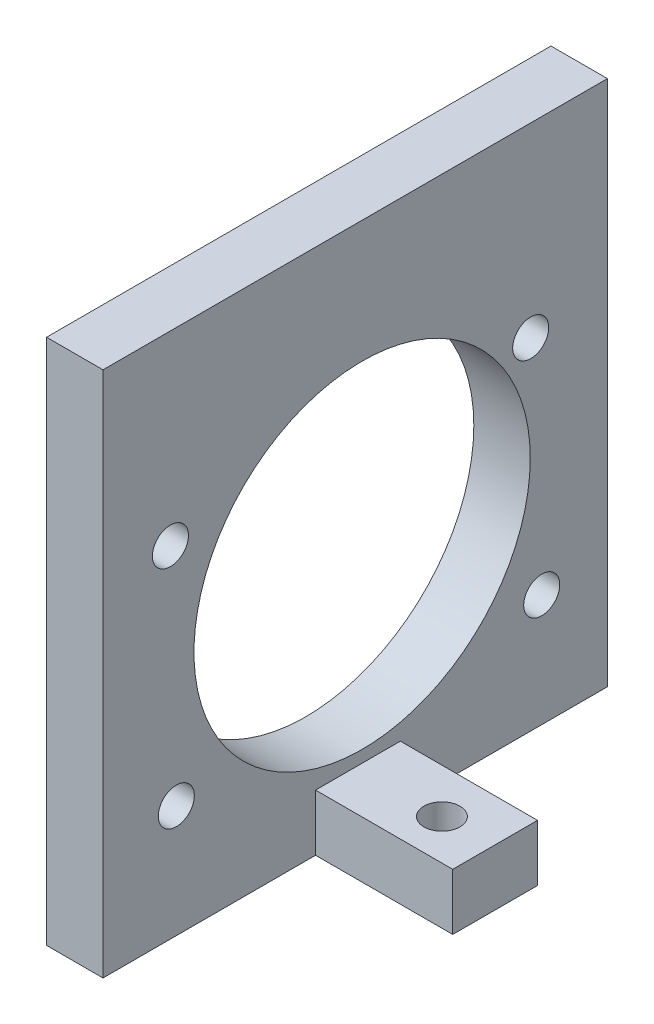
ISO-10303-21;
HEADER;
FILE_DESCRIPTION(('STEP AP214'),'2;1');
FILE_NAME('part.step','',(''),(''),'','','');
FILE_SCHEMA(('AUTOMOTIVE_DESIGN { 1 0 10303 214 1 1 1 1 }'));
ENDSEC;
DATA;
#1=APPLICATION_CONTEXT('core data for automotive mechanical design processes');
#2=APPLICATION_PROTOCOL_DEFINITION('international standard','automotive_design',2000,#1);
#3=PRODUCT_CONTEXT('',#1,'mechanical');
#4=PRODUCT('Part','Part','',(#3));
#5=PRODUCT_RELATED_PRODUCT_CATEGORY('part','',(#4));
#6=PRODUCT_DEFINITION_FORMATION('','',#4);
#7=PRODUCT_DEFINITION_CONTEXT('part definition',#1,'design');
#8=PRODUCT_DEFINITION('design','',#6,#7);
#9=PRODUCT_DEFINITION_SHAPE('','',#8);
#10=(LENGTH_UNIT() NAMED_UNIT(*) SI_UNIT(.MILLI.,.METRE.));
#11=(NAMED_UNIT(*) PLANE_ANGLE_UNIT() SI_UNIT($,.RADIAN.));
#12=(NAMED_UNIT(*) SI_UNIT($,.STERADIAN.) SOLID_ANGLE_UNIT());
#13=UNCERTAINTY_MEASURE_WITH_UNIT(LENGTH_MEASURE(1.E-05),#10,'distance_accuracy_value','');
#14=(GEOMETRIC_REPRESENTATION_CONTEXT(3) GLOBAL_UNCERTAINTY_ASSIGNED_CONTEXT((#13)) GLOBAL_UNIT_ASSIGNED_CONTEXT((#10,
#11,#12)) REPRESENTATION_CONTEXT('',''));
#15=CARTESIAN_POINT('',(0.,0.,0.));
#16=DIRECTION('',(0.,0.,1.));
#17=DIRECTION('',(1.,0.,0.));
#18=AXIS2_PLACEMENT_3D('',#15,#16,#17);
#19=CARTESIAN_POINT('',(0.,-4.7,-42.));
#20=DIRECTION('',(0.,-1.,0.));
#21=DIRECTION('',(0.,0.,-1.));
#22=AXIS2_PLACEMENT_3D('',#19,#20,#21);
#23=PLANE('',#22);
#24=DIRECTION('',(0.,0.,1.));
#25=VECTOR('',#24,1.);
#26=CARTESIAN_POINT('',(11.4209266178207,-4.7,-24.7581515831649));
#27=LINE('',#26,#25);
#28=CARTESIAN_POINT('',(11.4209266178207,-4.7,-24.7581515831649));
#29=VERTEX_POINT('',#28);
#30=CARTESIAN_POINT('',(11.4209266178207,-4.7,-17.6984171354406));
#31=VERTEX_POINT('',#30);
#32=EDGE_CURVE('E62',#29,#31,#27,.T.);
#33=ORIENTED_EDGE('',*,*,#32,.T.);
#34=DIRECTION('',(-1.,0.,0.));
#35=VECTOR('',#34,1.);
#36=CARTESIAN_POINT('',(0.,-4.7,-17.6984171354406));
#37=LINE('',#36,#35);
#38=CARTESIAN_POINT('',(0.,-4.7,-17.6984171354406));
#39=VERTEX_POINT('',#38);
#40=EDGE_CURVE('E124',#31,#39,#37,.T.);
#41=ORIENTED_EDGE('',*,*,#40,.T.);
#42=DIRECTION('',(0.,0.,1.));
#43=VECTOR('',#42,1.);
#44=CARTESIAN_POINT('',(0.,-4.7,-17.6984171354406));
#45=LINE('',#44,#43);
#46=CARTESIAN_POINT('',(0.,-4.7,0.));
#47=VERTEX_POINT('',#46);
#48=EDGE_CURVE('E136',#39,#47,#45,.T.);
#49=ORIENTED_EDGE('',*,*,#48,.T.);
#50=DIRECTION('',(1.,0.,0.));
#51=VECTOR('',#50,1.);
#52=CARTESIAN_POINT('',(0.,-4.7,0.));
#53=LINE('',#52,#51);
#54=CARTESIAN_POINT('',(-4.7,-4.7,0.));
#55=VERTEX_POINT('',#54);
#56=EDGE_CURVE('E203',#55,#47,#53,.T.);
#57=ORIENTED_EDGE('',*,*,#56,.F.);
#58=DIRECTION('',(0.,0.,1.));
#59=VECTOR('',#58,1.);
#60=CARTESIAN_POINT('',(-4.7,-4.7,-42.));
#61=LINE('',#60,#59);
#62=CARTESIAN_POINT('',(-4.7,-4.7,-42.));
#63=VERTEX_POINT('',#62);
#64=EDGE_CURVE('E11',#63,#55,#61,.T.);
#65=ORIENTED_EDGE('',*,*,#64,.F.);
#66=DIRECTION('',(1.,0.,0.));
#67=VECTOR('',#66,1.);
#68=CARTESIAN_POINT('',(0.,-4.7,-42.));
#69=LINE('',#68,#67);
#70=CARTESIAN_POINT('',(0.,-4.7,-42.));
#71=VERTEX_POINT('',#70);
#72=EDGE_CURVE('E207',#63,#71,#69,.T.);
#73=ORIENTED_EDGE('',*,*,#72,.T.);
#74=DIRECTION('',(0.,0.,1.));
#75=VECTOR('',#74,1.);
#76=CARTESIAN_POINT('',(0.,-4.7,-42.));
#77=LINE('',#76,#75);
#78=CARTESIAN_POINT('',(0.,-4.7,-24.7581515831649));
#79=VERTEX_POINT('',#78);
#80=EDGE_CURVE('E154',#71,#79,#77,.T.);
#81=ORIENTED_EDGE('',*,*,#80,.T.);
#82=DIRECTION('',(1.,0.,0.));
#83=VECTOR('',#82,1.);
#84=CARTESIAN_POINT('',(0.,-4.7,-24.7581515831649));
#85=LINE('',#84,#83);
#86=EDGE_CURVE('E128',#79,#29,#85,.T.);
#87=ORIENTED_EDGE('',*,*,#86,.T.);
#88=EDGE_LOOP('',(#33,#41,#49,#57,#65,#73,#81,#87));
#89=FACE_BOUND('',#88,.T.);
#90=CARTESIAN_POINT('',(7.16622607131473,-4.7,-21.0521348067814));
#91=DIRECTION('',(0.,1.,0.));
#92=DIRECTION('',(0.,0.,1.));
#93=AXIS2_PLACEMENT_3D('',#90,#91,#92);
#94=CIRCLE('',#93,1.5);
#95=CARTESIAN_POINT('',(7.16622607131473,-4.7,-19.5521348067814));
#96=VERTEX_POINT('',#95);
#97=EDGE_CURVE('E199',#96,#96,#94,.T.);
#98=ORIENTED_EDGE('',*,*,#97,.T.);
#99=EDGE_LOOP('',(#98));
#100=FACE_BOUND('',#99,.T.);
#101=ADVANCED_FACE('F45',(#89,#100),#23,.T.);
#102=CARTESIAN_POINT('',(-4.7,0.,-42.));
#103=DIRECTION('',(-1.,0.,0.));
#104=DIRECTION('',(0.,0.,1.));
#105=AXIS2_PLACEMENT_3D('',#102,#103,#104);
#106=PLANE('',#105);
#107=CARTESIAN_POINT('',(-4.7,4.65966855667947,-6.10133774647746));
#108=DIRECTION('',(1.,0.,0.));
#109=DIRECTION('',(0.,0.,-1.));
#110=AXIS2_PLACEMENT_3D('',#107,#108,#109);
#111=CIRCLE('',#110,1.5);
#112=CARTESIAN_POINT('',(-4.7,4.65966855667947,-7.60133774647746));
#113=VERTEX_POINT('',#112);
#114=EDGE_CURVE('E172',#113,#113,#111,.T.);
#115=ORIENTED_EDGE('',*,*,#114,.T.);
#116=EDGE_LOOP('',(#115));
#117=FACE_BOUND('',#116,.T.);
#118=CARTESIAN_POINT('',(-4.7,23.6596685566795,-35.612051992341));
#119=DIRECTION('',(1.,0.,0.));
#120=DIRECTION('',(0.,0.,-1.));
#121=AXIS2_PLACEMENT_3D('',#118,#119,#120);
#122=CIRCLE('',#121,1.5);
#123=CARTESIAN_POINT('',(-4.7,23.6596685566795,-37.112051992341));
#124=VERTEX_POINT('',#123);
#125=EDGE_CURVE('E163',#124,#124,#122,.T.);
#126=ORIENTED_EDGE('',*,*,#125,.T.);
#127=EDGE_LOOP('',(#126));
#128=FACE_BOUND('',#127,.T.);
#129=CARTESIAN_POINT('',(-4.7,4.65966855667947,-36.5294627813469));
#130=DIRECTION('',(1.,0.,0.));
#131=DIRECTION('',(0.,0.,-1.));
#132=AXIS2_PLACEMENT_3D('',#129,#130,#131);
#133=CIRCLE('',#132,1.5);
#134=CARTESIAN_POINT('',(-4.7,4.65966855667947,-38.0294627813469));
#135=VERTEX_POINT('',#134);
#136=EDGE_CURVE('E140',#135,#135,#133,.T.);
#137=ORIENTED_EDGE('',*,*,#136,.T.);
#138=EDGE_LOOP('',(#137));
#139=FACE_BOUND('',#138,.T.);
#140=CARTESIAN_POINT('',(-4.7,23.6596685566795,-5.61205199234096));
#141=DIRECTION('',(1.,0.,0.));
#142=DIRECTION('',(0.,0.,-1.));
#143=AXIS2_PLACEMENT_3D('',#140,#141,#142);
#144=CIRCLE('',#143,1.5);
#145=CARTESIAN_POINT('',(-4.7,23.6596685566795,-7.11205199234096));
#146=VERTEX_POINT('',#145);
#147=EDGE_CURVE('E183',#146,#146,#144,.T.);
#148=ORIENTED_EDGE('',*,*,#147,.T.);
#149=EDGE_LOOP('',(#148));
#150=FACE_BOUND('',#149,.T.);
#151=CARTESIAN_POINT('',(-4.7,14.9958301128132,-21.5749997210445));
#152=DIRECTION('',(1.,0.,0.));
#153=DIRECTION('',(0.,0.,-1.));
#154=AXIS2_PLACEMENT_3D('',#151,#152,#153);
#155=CIRCLE('',#154,14.);
#156=CARTESIAN_POINT('',(-4.7,14.9958301128132,-35.5749997210445));
#157=VERTEX_POINT('',#156);
#158=EDGE_CURVE('E191',#157,#157,#155,.T.);
#159=ORIENTED_EDGE('',*,*,#158,.T.);
#160=EDGE_LOOP('',(#159));
#161=FACE_BOUND('',#160,.T.);
#162=DIRECTION('',(0.,1.,0.));
#163=VECTOR('',#162,1.);
#164=CARTESIAN_POINT('',(-4.7,0.,0.));
#165=LINE('',#164,#163);
#166=CARTESIAN_POINT('',(-4.7,39.156392732122,0.));
#167=VERTEX_POINT('',#166);
#168=EDGE_CURVE('E211',#167,#55,#165,.F.);
#169=ORIENTED_EDGE('',*,*,#168,.F.);
#170=DIRECTION('',(0.,0.,1.));
#171=VECTOR('',#170,1.);
#172=CARTESIAN_POINT('',(-4.7,39.156392732122,-42.));
#173=LINE('',#172,#171);
#174=CARTESIAN_POINT('',(-4.7,39.156392732122,-42.));
#175=VERTEX_POINT('',#174);
#176=EDGE_CURVE('E54',#175,#167,#173,.T.);
#177=ORIENTED_EDGE('',*,*,#176,.F.);
#178=DIRECTION('',(0.,1.,0.));
#179=VECTOR('',#178,1.);
#180=CARTESIAN_POINT('',(-4.7,0.,-42.));
#181=LINE('',#180,#179);
#182=EDGE_CURVE('E217',#175,#63,#181,.F.);
#183=ORIENTED_EDGE('',*,*,#182,.T.);
#184=ORIENTED_EDGE('',*,*,#64,.T.);
#185=EDGE_LOOP('',(#169,#177,#183,#184));
#186=FACE_BOUND('',#185,.T.);
#187=ADVANCED_FACE('F253',(#117,#128,#139,#150,#161,#186),#106,.T.);
#188=CARTESIAN_POINT('',(-4.7,39.156392732122,-42.));
#189=DIRECTION('',(0.,-1.,0.));
#190=DIRECTION('',(0.,0.,-1.));
#191=AXIS2_PLACEMENT_3D('',#188,#189,#190);
#192=PLANE('',#191);
#193=DIRECTION('',(1.,0.,0.));
#194=VECTOR('',#193,1.);
#195=CARTESIAN_POINT('',(-4.7,39.156392732122,0.));
#196=LINE('',#195,#194);
#197=CARTESIAN_POINT('',(0.,39.156392732122,0.));
#198=VERTEX_POINT('',#197);
#199=EDGE_CURVE('E227',#167,#198,#196,.T.);
#200=ORIENTED_EDGE('',*,*,#199,.T.);
#201=DIRECTION('',(0.,0.,1.));
#202=VECTOR('',#201,1.);
#203=CARTESIAN_POINT('',(0.,39.156392732122,-42.));
#204=LINE('',#203,#202);
#205=CARTESIAN_POINT('',(0.,39.156392732122,-42.));
#206=VERTEX_POINT('',#205);
#207=EDGE_CURVE('E234',#206,#198,#204,.T.);
#208=ORIENTED_EDGE('',*,*,#207,.F.);
#209=DIRECTION('',(1.,0.,0.));
#210=VECTOR('',#209,1.);
#211=CARTESIAN_POINT('',(-4.7,39.156392732122,-42.));
#212=LINE('',#211,#210);
#213=EDGE_CURVE('E214',#175,#206,#212,.T.);
#214=ORIENTED_EDGE('',*,*,#213,.F.);
#215=ORIENTED_EDGE('',*,*,#176,.T.);
#216=EDGE_LOOP('',(#200,#208,#214,#215));
#217=FACE_BOUND('',#216,.T.);
#218=ADVANCED_FACE('F258',(#217),#192,.F.);
#219=CARTESIAN_POINT('',(0.,0.,-42.));
#220=DIRECTION('',(-1.,0.,0.));
#221=DIRECTION('',(0.,0.,1.));
#222=AXIS2_PLACEMENT_3D('',#219,#220,#221);
#223=PLANE('',#222);
#224=CARTESIAN_POINT('',(0.,4.65966855667947,-6.10133774647746));
#225=DIRECTION('',(1.,0.,0.));
#226=DIRECTION('',(0.,0.,-1.));
#227=AXIS2_PLACEMENT_3D('',#224,#225,#226);
#228=CIRCLE('',#227,1.5);
#229=CARTESIAN_POINT('',(0.,4.65966855667947,-7.60133774647746));
#230=VERTEX_POINT('',#229);
#231=EDGE_CURVE('E167',#230,#230,#228,.T.);
#232=ORIENTED_EDGE('',*,*,#231,.F.);
#233=EDGE_LOOP('',(#232));
#234=FACE_BOUND('',#233,.T.);
#235=CARTESIAN_POINT('',(0.,23.6596685566795,-35.612051992341));
#236=DIRECTION('',(1.,0.,0.));
#237=DIRECTION('',(0.,0.,-1.));
#238=AXIS2_PLACEMENT_3D('',#235,#236,#237);
#239=CIRCLE('',#238,1.5);
#240=CARTESIAN_POINT('',(0.,23.6596685566795,-37.112051992341));
#241=VERTEX_POINT('',#240);
#242=EDGE_CURVE('E176',#241,#241,#239,.T.);
#243=ORIENTED_EDGE('',*,*,#242,.F.);
#244=EDGE_LOOP('',(#243));
#245=FACE_BOUND('',#244,.T.);
#246=CARTESIAN_POINT('',(0.,4.65966855667947,-36.5294627813469));
#247=DIRECTION('',(1.,0.,0.));
#248=DIRECTION('',(0.,0.,-1.));
#249=AXIS2_PLACEMENT_3D('',#246,#247,#248);
#250=CIRCLE('',#249,1.5);
#251=CARTESIAN_POINT('',(0.,4.65966855667947,-38.0294627813469));
#252=VERTEX_POINT('',#251);
#253=EDGE_CURVE('E159',#252,#252,#250,.T.);
#254=ORIENTED_EDGE('',*,*,#253,.F.);
#255=EDGE_LOOP('',(#254));
#256=FACE_BOUND('',#255,.T.);
#257=CARTESIAN_POINT('',(0.,23.6596685566795,-5.61205199234096));
#258=DIRECTION('',(1.,0.,0.));
#259=DIRECTION('',(0.,0.,-1.));
#260=AXIS2_PLACEMENT_3D('',#257,#258,#259);
#261=CIRCLE('',#260,1.5);
#262=CARTESIAN_POINT('',(0.,23.6596685566795,-7.11205199234096));
#263=VERTEX_POINT('',#262);
#264=EDGE_CURVE('E171',#263,#263,#261,.T.);
#265=ORIENTED_EDGE('',*,*,#264,.F.);
#266=EDGE_LOOP('',(#265));
#267=FACE_BOUND('',#266,.T.);
#268=CARTESIAN_POINT('',(0.,14.9958301128132,-21.5749997210445));
#269=DIRECTION('',(1.,0.,0.));
#270=DIRECTION('',(0.,0.,-1.));
#271=AXIS2_PLACEMENT_3D('',#268,#269,#270);
#272=CIRCLE('',#271,14.);
#273=CARTESIAN_POINT('',(0.,14.9958301128132,-35.5749997210445));
#274=VERTEX_POINT('',#273);
#275=EDGE_CURVE('E187',#274,#274,#272,.T.);
#276=ORIENTED_EDGE('',*,*,#275,.F.);
#277=EDGE_LOOP('',(#276));
#278=FACE_BOUND('',#277,.T.);
#279=DIRECTION('',(0.,-1.,0.));
#280=VECTOR('',#279,1.);
#281=CARTESIAN_POINT('',(0.,0.,0.));
#282=LINE('',#281,#280);
#283=EDGE_CURVE('E224',#198,#47,#282,.T.);
#284=ORIENTED_EDGE('',*,*,#283,.T.);
#285=ORIENTED_EDGE('',*,*,#48,.F.);
#286=DIRECTION('',(0.,1.,0.));
#287=VECTOR('',#286,1.);
#288=CARTESIAN_POINT('',(0.,-4.7,-17.6984171354406));
#289=LINE('',#288,#287);
#290=CARTESIAN_POINT('',(0.,0.,-17.6984171354406));
#291=VERTEX_POINT('',#290);
#292=EDGE_CURVE('E133',#39,#291,#289,.T.);
#293=ORIENTED_EDGE('',*,*,#292,.T.);
#294=DIRECTION('',(0.,0.,1.));
#295=VECTOR('',#294,1.);
#296=CARTESIAN_POINT('',(0.,0.,-42.));
#297=LINE('',#296,#295);
#298=CARTESIAN_POINT('',(0.,0.,-24.7581515831649));
#299=VERTEX_POINT('',#298);
#300=EDGE_CURVE('E48',#299,#291,#297,.T.);
#301=ORIENTED_EDGE('',*,*,#300,.F.);
#302=DIRECTION('',(0.,1.,0.));
#303=VECTOR('',#302,1.);
#304=CARTESIAN_POINT('',(0.,-4.7,-24.7581515831649));
#305=LINE('',#304,#303);
#306=EDGE_CURVE('E148',#79,#299,#305,.T.);
#307=ORIENTED_EDGE('',*,*,#306,.F.);
#308=ORIENTED_EDGE('',*,*,#80,.F.);
#309=DIRECTION('',(0.,-1.,0.));
#310=VECTOR('',#309,1.);
#311=CARTESIAN_POINT('',(0.,0.,-42.));
#312=LINE('',#311,#310);
#313=EDGE_CURVE('E70',#206,#71,#312,.T.);
#314=ORIENTED_EDGE('',*,*,#313,.F.);
#315=ORIENTED_EDGE('',*,*,#207,.T.);
#316=EDGE_LOOP('',(#284,#285,#293,#301,#307,#308,#314,#315));
#317=FACE_BOUND('',#316,.T.);
#318=ADVANCED_FACE('F246',(#234,#245,#256,#267,#278,#317),#223,.F.);
#319=CARTESIAN_POINT('',(0.,0.,-42.));
#320=DIRECTION('',(0.,-1.,0.));
#321=DIRECTION('',(0.,0.,-1.));
#322=AXIS2_PLACEMENT_3D('',#319,#320,#321);
#323=PLANE('',#322);
#324=CARTESIAN_POINT('',(7.16622607131473,0.,-21.0521348067814));
#325=DIRECTION('',(0.,1.,0.));
#326=DIRECTION('',(0.,0.,1.));
#327=AXIS2_PLACEMENT_3D('',#324,#325,#326);
#328=CIRCLE('',#327,1.5);
#329=CARTESIAN_POINT('',(7.16622607131473,0.,-19.5521348067814));
#330=VERTEX_POINT('',#329);
#331=EDGE_CURVE('E195',#330,#330,#328,.T.);
#332=ORIENTED_EDGE('',*,*,#331,.F.);
#333=EDGE_LOOP('',(#332));
#334=FACE_BOUND('',#333,.T.);
#335=DIRECTION('',(-1.,0.,0.));
#336=VECTOR('',#335,1.);
#337=CARTESIAN_POINT('',(0.,0.,-17.6984171354406));
#338=LINE('',#337,#336);
#339=CARTESIAN_POINT('',(11.4209266178207,0.,-17.6984171354406));
#340=VERTEX_POINT('',#339);
#341=EDGE_CURVE('E142',#340,#291,#338,.T.);
#342=ORIENTED_EDGE('',*,*,#341,.F.);
#343=DIRECTION('',(0.,0.,1.));
#344=VECTOR('',#343,1.);
#345=CARTESIAN_POINT('',(11.4209266178207,0.,-24.7581515831649));
#346=LINE('',#345,#344);
#347=CARTESIAN_POINT('',(11.4209266178207,0.,-24.7581515831649));
#348=VERTEX_POINT('',#347);
#349=EDGE_CURVE('E113',#348,#340,#346,.T.);
#350=ORIENTED_EDGE('',*,*,#349,.F.);
#351=DIRECTION('',(1.,0.,0.));
#352=VECTOR('',#351,1.);
#353=CARTESIAN_POINT('',(0.,0.,-24.7581515831649));
#354=LINE('',#353,#352);
#355=EDGE_CURVE('E146',#299,#348,#354,.T.);
#356=ORIENTED_EDGE('',*,*,#355,.F.);
#357=ORIENTED_EDGE('',*,*,#300,.T.);
#358=EDGE_LOOP('',(#342,#350,#356,#357));
#359=FACE_BOUND('',#358,.T.);
#360=ADVANCED_FACE('F245',(#334,#359),#323,.F.);
#361=CARTESIAN_POINT('',(0.,0.,-42.));
#362=DIRECTION('',(0.,0.,-1.));
#363=DIRECTION('',(-1.,0.,0.));
#364=AXIS2_PLACEMENT_3D('',#361,#362,#363);
#365=PLANE('',#364);
#366=ORIENTED_EDGE('',*,*,#313,.T.);
#367=ORIENTED_EDGE('',*,*,#72,.F.);
#368=ORIENTED_EDGE('',*,*,#182,.F.);
#369=ORIENTED_EDGE('',*,*,#213,.T.);
#370=EDGE_LOOP('',(#366,#367,#368,#369));
#371=FACE_BOUND('',#370,.T.);
#372=ADVANCED_FACE('F256',(#371),#365,.T.);
#373=CARTESIAN_POINT('',(0.,0.,0.));
#374=DIRECTION('',(0.,0.,-1.));
#375=DIRECTION('',(-1.,0.,0.));
#376=AXIS2_PLACEMENT_3D('',#373,#374,#375);
#377=PLANE('',#376);
#378=ORIENTED_EDGE('',*,*,#56,.T.);
#379=ORIENTED_EDGE('',*,*,#283,.F.);
#380=ORIENTED_EDGE('',*,*,#199,.F.);
#381=ORIENTED_EDGE('',*,*,#168,.T.);
#382=EDGE_LOOP('',(#378,#379,#380,#381));
#383=FACE_BOUND('',#382,.T.);
#384=ADVANCED_FACE('F249',(#383),#377,.F.);
#385=CARTESIAN_POINT('',(7.16622607131473,-4.7,-21.0521348067814));
#386=DIRECTION('',(0.,1.,0.));
#387=DIRECTION('',(0.,0.,1.));
#388=AXIS2_PLACEMENT_3D('',#385,#386,#387);
#389=CYLINDRICAL_SURFACE('',#388,1.5);
#390=ORIENTED_EDGE('',*,*,#97,.F.);
#391=EDGE_LOOP('',(#390));
#392=FACE_BOUND('',#391,.T.);
#393=ORIENTED_EDGE('',*,*,#331,.T.);
#394=EDGE_LOOP('',(#393));
#395=FACE_BOUND('',#394,.T.);
#396=ADVANCED_FACE('F360',(#392,#395),#389,.F.);
#397=CARTESIAN_POINT('',(-4.7,14.9958301128132,-21.5749997210445));
#398=DIRECTION('',(1.,0.,0.));
#399=DIRECTION('',(0.,0.,-1.));
#400=AXIS2_PLACEMENT_3D('',#397,#398,#399);
#401=CYLINDRICAL_SURFACE('',#400,14.);
#402=ORIENTED_EDGE('',*,*,#158,.F.);
#403=EDGE_LOOP('',(#402));
#404=FACE_BOUND('',#403,.T.);
#405=ORIENTED_EDGE('',*,*,#275,.T.);
#406=EDGE_LOOP('',(#405));
#407=FACE_BOUND('',#406,.T.);
#408=ADVANCED_FACE('F351',(#404,#407),#401,.F.);
#409=CARTESIAN_POINT('',(-4.7,23.6596685566795,-5.61205199234096));
#410=DIRECTION('',(1.,0.,0.));
#411=DIRECTION('',(0.,0.,-1.));
#412=AXIS2_PLACEMENT_3D('',#409,#410,#411);
#413=CYLINDRICAL_SURFACE('',#412,1.5);
#414=ORIENTED_EDGE('',*,*,#147,.F.);
#415=EDGE_LOOP('',(#414));
#416=FACE_BOUND('',#415,.T.);
#417=ORIENTED_EDGE('',*,*,#264,.T.);
#418=EDGE_LOOP('',(#417));
#419=FACE_BOUND('',#418,.T.);
#420=ADVANCED_FACE('F342',(#416,#419),#413,.F.);
#421=CARTESIAN_POINT('',(-4.7,4.65966855667947,-36.5294627813469));
#422=DIRECTION('',(1.,0.,0.));
#423=DIRECTION('',(0.,0.,-1.));
#424=AXIS2_PLACEMENT_3D('',#421,#422,#423);
#425=CYLINDRICAL_SURFACE('',#424,1.5);
#426=ORIENTED_EDGE('',*,*,#136,.F.);
#427=EDGE_LOOP('',(#426));
#428=FACE_BOUND('',#427,.T.);
#429=ORIENTED_EDGE('',*,*,#253,.T.);
#430=EDGE_LOOP('',(#429));
#431=FACE_BOUND('',#430,.T.);
#432=ADVANCED_FACE('F333',(#428,#431),#425,.F.);
#433=CARTESIAN_POINT('',(-4.7,23.6596685566795,-35.612051992341));
#434=DIRECTION('',(1.,0.,0.));
#435=DIRECTION('',(0.,0.,-1.));
#436=AXIS2_PLACEMENT_3D('',#433,#434,#435);
#437=CYLINDRICAL_SURFACE('',#436,1.5);
#438=ORIENTED_EDGE('',*,*,#125,.F.);
#439=EDGE_LOOP('',(#438));
#440=FACE_BOUND('',#439,.T.);
#441=ORIENTED_EDGE('',*,*,#242,.T.);
#442=EDGE_LOOP('',(#441));
#443=FACE_BOUND('',#442,.T.);
#444=ADVANCED_FACE('F323',(#440,#443),#437,.F.);
#445=CARTESIAN_POINT('',(-4.7,4.65966855667947,-6.10133774647746));
#446=DIRECTION('',(1.,0.,0.));
#447=DIRECTION('',(0.,0.,-1.));
#448=AXIS2_PLACEMENT_3D('',#445,#446,#447);
#449=CYLINDRICAL_SURFACE('',#448,1.5);
#450=ORIENTED_EDGE('',*,*,#114,.F.);
#451=EDGE_LOOP('',(#450));
#452=FACE_BOUND('',#451,.T.);
#453=ORIENTED_EDGE('',*,*,#231,.T.);
#454=EDGE_LOOP('',(#453));
#455=FACE_BOUND('',#454,.T.);
#456=ADVANCED_FACE('F295',(#452,#455),#449,.F.);
#457=CARTESIAN_POINT('',(0.,-4.7,-17.6984171354406));
#458=DIRECTION('',(0.,0.,-1.));
#459=DIRECTION('',(-1.,0.,0.));
#460=AXIS2_PLACEMENT_3D('',#457,#458,#459);
#461=PLANE('',#460);
#462=ORIENTED_EDGE('',*,*,#40,.F.);
#463=DIRECTION('',(0.,1.,0.));
#464=VECTOR('',#463,1.);
#465=CARTESIAN_POINT('',(11.4209266178207,-4.7,-17.6984171354406));
#466=LINE('',#465,#464);
#467=EDGE_CURVE('E110',#31,#340,#466,.T.);
#468=ORIENTED_EDGE('',*,*,#467,.T.);
#469=ORIENTED_EDGE('',*,*,#341,.T.);
#470=ORIENTED_EDGE('',*,*,#292,.F.);
#471=EDGE_LOOP('',(#462,#468,#469,#470));
#472=FACE_BOUND('',#471,.T.);
#473=ADVANCED_FACE('F131',(#472),#461,.F.);
#474=CARTESIAN_POINT('',(0.,-4.7,-24.7581515831649));
#475=DIRECTION('',(0.,0.,1.));
#476=DIRECTION('',(1.,0.,0.));
#477=AXIS2_PLACEMENT_3D('',#474,#475,#476);
#478=PLANE('',#477);
#479=ORIENTED_EDGE('',*,*,#355,.T.);
#480=DIRECTION('',(0.,1.,0.));
#481=VECTOR('',#480,1.);
#482=CARTESIAN_POINT('',(11.4209266178207,-4.7,-24.7581515831649));
#483=LINE('',#482,#481);
#484=EDGE_CURVE('E118',#29,#348,#483,.T.);
#485=ORIENTED_EDGE('',*,*,#484,.F.);
#486=ORIENTED_EDGE('',*,*,#86,.F.);
#487=ORIENTED_EDGE('',*,*,#306,.T.);
#488=EDGE_LOOP('',(#479,#485,#486,#487));
#489=FACE_BOUND('',#488,.T.);
#490=ADVANCED_FACE('F294',(#489),#478,.F.);
#491=CARTESIAN_POINT('',(11.4209266178207,-4.7,-24.7581515831649));
#492=DIRECTION('',(-1.,0.,0.));
#493=DIRECTION('',(0.,0.,1.));
#494=AXIS2_PLACEMENT_3D('',#491,#492,#493);
#495=PLANE('',#494);
#496=ORIENTED_EDGE('',*,*,#349,.T.);
#497=ORIENTED_EDGE('',*,*,#467,.F.);
#498=ORIENTED_EDGE('',*,*,#32,.F.);
#499=ORIENTED_EDGE('',*,*,#484,.T.);
#500=EDGE_LOOP('',(#496,#497,#498,#499));
#501=FACE_BOUND('',#500,.T.);
#502=ADVANCED_FACE('F111',(#501),#495,.F.);
#503=CLOSED_SHELL('',(#101,#187,#218,#318,#360,#372,#384,#396,#408,#420,#432,#444,#456,#473,
#490,#502));
#504=MANIFOLD_SOLID_BREP('B2',#503);
#505=ADVANCED_BREP_SHAPE_REPRESENTATION('',(#18,#504),#14);
#506=SHAPE_DEFINITION_REPRESENTATION(#9,#505);
ENDSEC;
END-ISO-10303-21;
